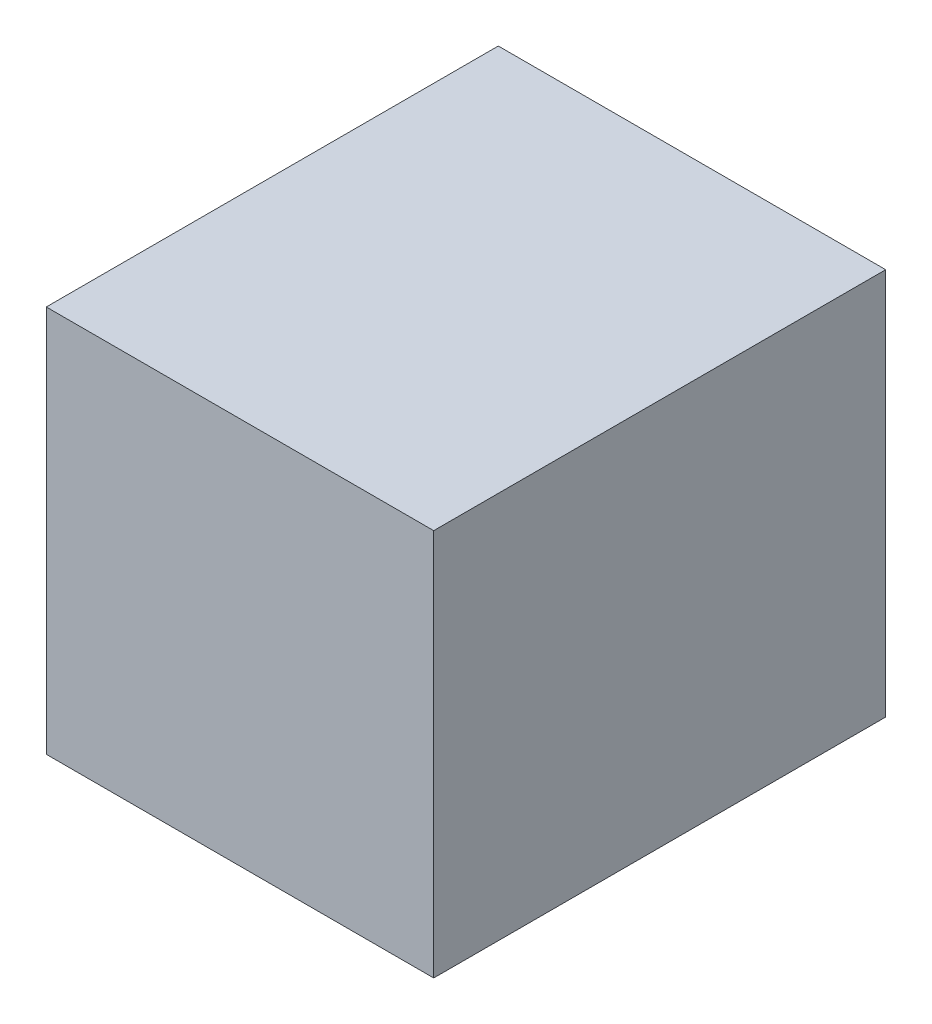
ISO-10303-21;
HEADER;
FILE_DESCRIPTION(('STEP AP214'),'2;1');
FILE_NAME('part.step','',(''),(''),'','','');
FILE_SCHEMA(('AUTOMOTIVE_DESIGN { 1 0 10303 214 1 1 1 1 }'));
ENDSEC;
DATA;
#1=APPLICATION_CONTEXT('core data for automotive mechanical design processes');
#2=APPLICATION_PROTOCOL_DEFINITION('international standard','automotive_design',2000,#1);
#3=PRODUCT_CONTEXT('',#1,'mechanical');
#4=PRODUCT('Part','Part','',(#3));
#5=PRODUCT_RELATED_PRODUCT_CATEGORY('part','',(#4));
#6=PRODUCT_DEFINITION_FORMATION('','',#4);
#7=PRODUCT_DEFINITION_CONTEXT('part definition',#1,'design');
#8=PRODUCT_DEFINITION('design','',#6,#7);
#9=PRODUCT_DEFINITION_SHAPE('','',#8);
#10=(LENGTH_UNIT() NAMED_UNIT(*) SI_UNIT(.MILLI.,.METRE.));
#11=(NAMED_UNIT(*) PLANE_ANGLE_UNIT() SI_UNIT($,.RADIAN.));
#12=(NAMED_UNIT(*) SI_UNIT($,.STERADIAN.) SOLID_ANGLE_UNIT());
#13=UNCERTAINTY_MEASURE_WITH_UNIT(LENGTH_MEASURE(1.E-05),#10,'distance_accuracy_value','');
#14=(GEOMETRIC_REPRESENTATION_CONTEXT(3) GLOBAL_UNCERTAINTY_ASSIGNED_CONTEXT((#13)) GLOBAL_UNIT_ASSIGNED_CONTEXT((#10,
#11,#12)) REPRESENTATION_CONTEXT('',''));
#15=CARTESIAN_POINT('',(0.,0.,0.));
#16=DIRECTION('',(0.,0.,1.));
#17=DIRECTION('',(1.,0.,0.));
#18=AXIS2_PLACEMENT_3D('',#15,#16,#17);
#19=CARTESIAN_POINT('',(300.,600.,-350.));
#20=DIRECTION('',(-1.,0.,0.));
#21=DIRECTION('',(0.,0.,1.));
#22=AXIS2_PLACEMENT_3D('',#19,#20,#21);
#23=PLANE('',#22);
#24=DIRECTION('',(0.,0.,-1.));
#25=VECTOR('',#24,1.);
#26=CARTESIAN_POINT('',(300.,0.,-350.));
#27=LINE('',#26,#25);
#28=CARTESIAN_POINT('',(300.,0.,350.));
#29=VERTEX_POINT('',#28);
#30=CARTESIAN_POINT('',(300.,0.,-350.));
#31=VERTEX_POINT('',#30);
#32=EDGE_CURVE('E102',#29,#31,#27,.T.);
#33=ORIENTED_EDGE('',*,*,#32,.T.);
#34=DIRECTION('',(0.,-1.,0.));
#35=VECTOR('',#34,1.);
#36=CARTESIAN_POINT('',(300.,600.,-350.));
#37=LINE('',#36,#35);
#38=CARTESIAN_POINT('',(300.,600.,-350.));
#39=VERTEX_POINT('',#38);
#40=EDGE_CURVE('E11',#39,#31,#37,.T.);
#41=ORIENTED_EDGE('',*,*,#40,.F.);
#42=DIRECTION('',(0.,0.,-1.));
#43=VECTOR('',#42,1.);
#44=CARTESIAN_POINT('',(300.,600.,-350.));
#45=LINE('',#44,#43);
#46=CARTESIAN_POINT('',(300.,600.,350.));
#47=VERTEX_POINT('',#46);
#48=EDGE_CURVE('E90',#47,#39,#45,.T.);
#49=ORIENTED_EDGE('',*,*,#48,.F.);
#50=DIRECTION('',(0.,-1.,0.));
#51=VECTOR('',#50,1.);
#52=CARTESIAN_POINT('',(300.,600.,350.));
#53=LINE('',#52,#51);
#54=EDGE_CURVE('E98',#47,#29,#53,.T.);
#55=ORIENTED_EDGE('',*,*,#54,.T.);
#56=EDGE_LOOP('',(#33,#41,#49,#55));
#57=FACE_BOUND('',#56,.T.);
#58=ADVANCED_FACE('F39',(#57),#23,.F.);
#59=CARTESIAN_POINT('',(-300.,600.,-350.));
#60=DIRECTION('',(0.,0.,1.));
#61=DIRECTION('',(1.,0.,0.));
#62=AXIS2_PLACEMENT_3D('',#59,#60,#61);
#63=PLANE('',#62);
#64=DIRECTION('',(-1.,0.,0.));
#65=VECTOR('',#64,1.);
#66=CARTESIAN_POINT('',(-300.,0.,-350.));
#67=LINE('',#66,#65);
#68=CARTESIAN_POINT('',(-300.,0.,-350.));
#69=VERTEX_POINT('',#68);
#70=EDGE_CURVE('E94',#31,#69,#67,.T.);
#71=ORIENTED_EDGE('',*,*,#70,.T.);
#72=DIRECTION('',(0.,-1.,0.));
#73=VECTOR('',#72,1.);
#74=CARTESIAN_POINT('',(-300.,600.,-350.));
#75=LINE('',#74,#73);
#76=CARTESIAN_POINT('',(-300.,600.,-350.));
#77=VERTEX_POINT('',#76);
#78=EDGE_CURVE('E47',#77,#69,#75,.T.);
#79=ORIENTED_EDGE('',*,*,#78,.F.);
#80=DIRECTION('',(-1.,0.,0.));
#81=VECTOR('',#80,1.);
#82=CARTESIAN_POINT('',(-300.,600.,-350.));
#83=LINE('',#82,#81);
#84=EDGE_CURVE('E85',#39,#77,#83,.T.);
#85=ORIENTED_EDGE('',*,*,#84,.F.);
#86=ORIENTED_EDGE('',*,*,#40,.T.);
#87=EDGE_LOOP('',(#71,#79,#85,#86));
#88=FACE_BOUND('',#87,.T.);
#89=ADVANCED_FACE('F93',(#88),#63,.F.);
#90=CARTESIAN_POINT('',(-300.,600.,-350.));
#91=DIRECTION('',(1.,0.,0.));
#92=DIRECTION('',(0.,0.,-1.));
#93=AXIS2_PLACEMENT_3D('',#90,#91,#92);
#94=PLANE('',#93);
#95=DIRECTION('',(0.,0.,1.));
#96=VECTOR('',#95,1.);
#97=CARTESIAN_POINT('',(-300.,0.,-350.));
#98=LINE('',#97,#96);
#99=CARTESIAN_POINT('',(-300.,0.,350.));
#100=VERTEX_POINT('',#99);
#101=EDGE_CURVE('E72',#69,#100,#98,.T.);
#102=ORIENTED_EDGE('',*,*,#101,.T.);
#103=DIRECTION('',(0.,-1.,0.));
#104=VECTOR('',#103,1.);
#105=CARTESIAN_POINT('',(-300.,600.,350.));
#106=LINE('',#105,#104);
#107=CARTESIAN_POINT('',(-300.,600.,350.));
#108=VERTEX_POINT('',#107);
#109=EDGE_CURVE('E95',#108,#100,#106,.T.);
#110=ORIENTED_EDGE('',*,*,#109,.F.);
#111=DIRECTION('',(0.,0.,1.));
#112=VECTOR('',#111,1.);
#113=CARTESIAN_POINT('',(-300.,600.,-350.));
#114=LINE('',#113,#112);
#115=EDGE_CURVE('E88',#77,#108,#114,.T.);
#116=ORIENTED_EDGE('',*,*,#115,.F.);
#117=ORIENTED_EDGE('',*,*,#78,.T.);
#118=EDGE_LOOP('',(#102,#110,#116,#117));
#119=FACE_BOUND('',#118,.T.);
#120=ADVANCED_FACE('F96',(#119),#94,.F.);
#121=CARTESIAN_POINT('',(-300.,600.,350.));
#122=DIRECTION('',(0.,0.,-1.));
#123=DIRECTION('',(-1.,0.,0.));
#124=AXIS2_PLACEMENT_3D('',#121,#122,#123);
#125=PLANE('',#124);
#126=DIRECTION('',(1.,0.,0.));
#127=VECTOR('',#126,1.);
#128=CARTESIAN_POINT('',(-300.,0.,350.));
#129=LINE('',#128,#127);
#130=EDGE_CURVE('E78',#100,#29,#129,.T.);
#131=ORIENTED_EDGE('',*,*,#130,.T.);
#132=ORIENTED_EDGE('',*,*,#54,.F.);
#133=DIRECTION('',(1.,0.,0.));
#134=VECTOR('',#133,1.);
#135=CARTESIAN_POINT('',(-300.,600.,350.));
#136=LINE('',#135,#134);
#137=EDGE_CURVE('E55',#108,#47,#136,.T.);
#138=ORIENTED_EDGE('',*,*,#137,.F.);
#139=ORIENTED_EDGE('',*,*,#109,.T.);
#140=EDGE_LOOP('',(#131,#132,#138,#139));
#141=FACE_BOUND('',#140,.T.);
#142=ADVANCED_FACE('F109',(#141),#125,.F.);
#143=CARTESIAN_POINT('',(0.,600.,0.));
#144=DIRECTION('',(0.,1.,0.));
#145=DIRECTION('',(0.,0.,1.));
#146=AXIS2_PLACEMENT_3D('',#143,#144,#145);
#147=PLANE('',#146);
#148=ORIENTED_EDGE('',*,*,#48,.T.);
#149=ORIENTED_EDGE('',*,*,#84,.T.);
#150=ORIENTED_EDGE('',*,*,#115,.T.);
#151=ORIENTED_EDGE('',*,*,#137,.T.);
#152=EDGE_LOOP('',(#148,#149,#150,#151));
#153=FACE_BOUND('',#152,.T.);
#154=ADVANCED_FACE('F86',(#153),#147,.T.);
#155=CARTESIAN_POINT('',(0.,0.,0.));
#156=DIRECTION('',(0.,1.,0.));
#157=DIRECTION('',(0.,0.,1.));
#158=AXIS2_PLACEMENT_3D('',#155,#156,#157);
#159=PLANE('',#158);
#160=ORIENTED_EDGE('',*,*,#32,.F.);
#161=ORIENTED_EDGE('',*,*,#130,.F.);
#162=ORIENTED_EDGE('',*,*,#101,.F.);
#163=ORIENTED_EDGE('',*,*,#70,.F.);
#164=EDGE_LOOP('',(#160,#161,#162,#163));
#165=FACE_BOUND('',#164,.T.);
#166=ADVANCED_FACE('F112',(#165),#159,.F.);
#167=CLOSED_SHELL('',(#58,#89,#120,#142,#154,#166));
#168=MANIFOLD_SOLID_BREP('B2',#167);
#169=ADVANCED_BREP_SHAPE_REPRESENTATION('',(#18,#168),#14);
#170=SHAPE_DEFINITION_REPRESENTATION(#9,#169);
ENDSEC;
END-ISO-10303-21;
